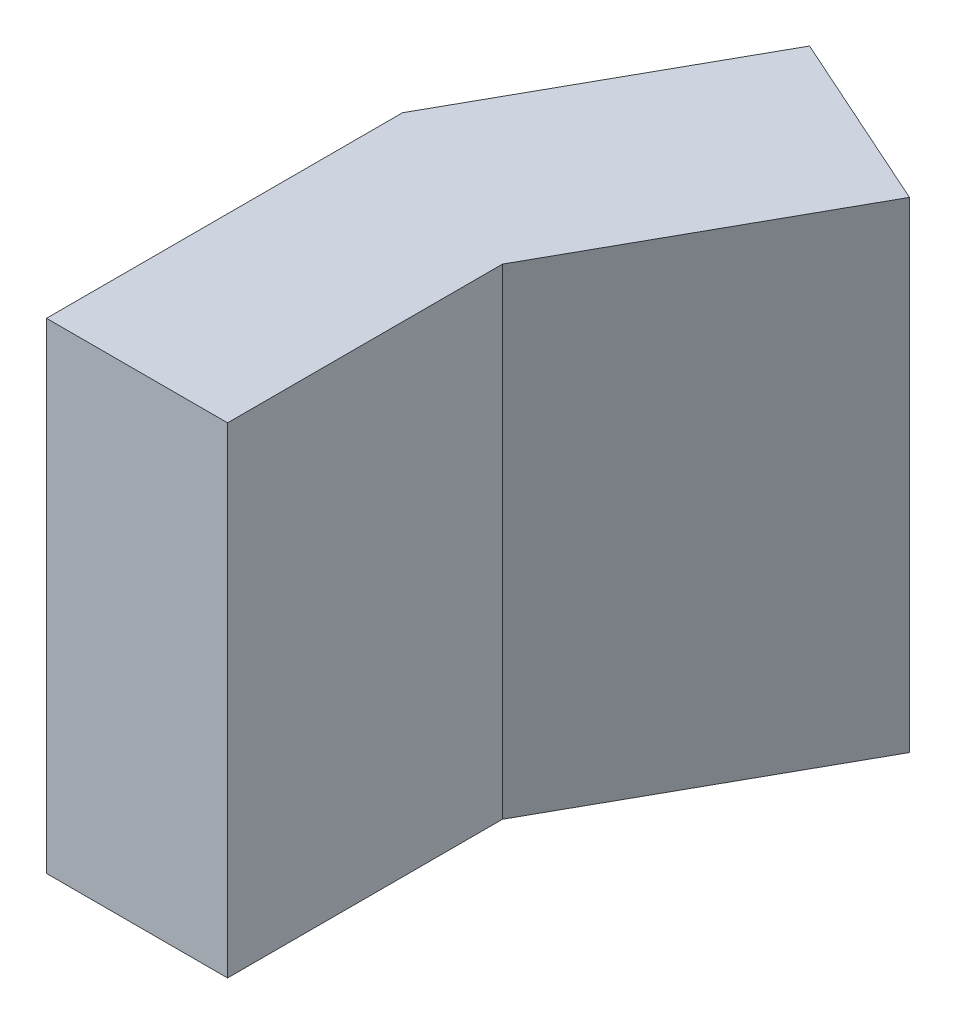
ISO-10303-21;
HEADER;
FILE_DESCRIPTION(('STEP AP214'),'2;1');
FILE_NAME('part.step','',(''),(''),'','','');
FILE_SCHEMA(('AUTOMOTIVE_DESIGN { 1 0 10303 214 1 1 1 1 }'));
ENDSEC;
DATA;
#1=APPLICATION_CONTEXT('core data for automotive mechanical design processes');
#2=APPLICATION_PROTOCOL_DEFINITION('international standard','automotive_design',2000,#1);
#3=PRODUCT_CONTEXT('',#1,'mechanical');
#4=PRODUCT('Part','Part','',(#3));
#5=PRODUCT_RELATED_PRODUCT_CATEGORY('part','',(#4));
#6=PRODUCT_DEFINITION_FORMATION('','',#4);
#7=PRODUCT_DEFINITION_CONTEXT('part definition',#1,'design');
#8=PRODUCT_DEFINITION('design','',#6,#7);
#9=PRODUCT_DEFINITION_SHAPE('','',#8);
#10=(LENGTH_UNIT() NAMED_UNIT(*) SI_UNIT(.MILLI.,.METRE.));
#11=(NAMED_UNIT(*) PLANE_ANGLE_UNIT() SI_UNIT($,.RADIAN.));
#12=(NAMED_UNIT(*) SI_UNIT($,.STERADIAN.) SOLID_ANGLE_UNIT());
#13=UNCERTAINTY_MEASURE_WITH_UNIT(LENGTH_MEASURE(1.E-05),#10,'distance_accuracy_value','');
#14=(GEOMETRIC_REPRESENTATION_CONTEXT(3) GLOBAL_UNCERTAINTY_ASSIGNED_CONTEXT((#13)) GLOBAL_UNIT_ASSIGNED_CONTEXT((#10,
#11,#12)) REPRESENTATION_CONTEXT('',''));
#15=CARTESIAN_POINT('',(0.,0.,0.));
#16=DIRECTION('',(0.,0.,1.));
#17=DIRECTION('',(1.,0.,0.));
#18=AXIS2_PLACEMENT_3D('',#15,#16,#17);
#19=CARTESIAN_POINT('',(-11.,58.42,0.));
#20=DIRECTION('',(-1.,0.,0.));
#21=DIRECTION('',(0.,0.,1.));
#22=AXIS2_PLACEMENT_3D('',#19,#20,#21);
#23=PLANE('',#22);
#24=DIRECTION('',(0.,0.,-1.));
#25=VECTOR('',#24,1.);
#26=CARTESIAN_POINT('',(-11.,0.,0.));
#27=LINE('',#26,#25);
#28=CARTESIAN_POINT('',(-11.,0.,11.0170643207002));
#29=VERTEX_POINT('',#28);
#30=CARTESIAN_POINT('',(-11.,0.,-32.2459666858922));
#31=VERTEX_POINT('',#30);
#32=EDGE_CURVE('E128',#29,#31,#27,.T.);
#33=ORIENTED_EDGE('',*,*,#32,.F.);
#34=DIRECTION('',(0.,-1.,0.));
#35=VECTOR('',#34,1.);
#36=CARTESIAN_POINT('',(-11.,58.42,11.0170643207002));
#37=LINE('',#36,#35);
#38=CARTESIAN_POINT('',(-11.,58.42,11.0170643207002));
#39=VERTEX_POINT('',#38);
#40=EDGE_CURVE('E11',#39,#29,#37,.T.);
#41=ORIENTED_EDGE('',*,*,#40,.F.);
#42=DIRECTION('',(0.,0.,-1.));
#43=VECTOR('',#42,1.);
#44=CARTESIAN_POINT('',(-11.,58.42,0.));
#45=LINE('',#44,#43);
#46=CARTESIAN_POINT('',(-11.,58.42,-32.2459666858922));
#47=VERTEX_POINT('',#46);
#48=EDGE_CURVE('E147',#39,#47,#45,.T.);
#49=ORIENTED_EDGE('',*,*,#48,.T.);
#50=DIRECTION('',(0.,-1.,0.));
#51=VECTOR('',#50,1.);
#52=CARTESIAN_POINT('',(-11.,58.42,-32.2459666858922));
#53=LINE('',#52,#51);
#54=EDGE_CURVE('E58',#47,#31,#53,.T.);
#55=ORIENTED_EDGE('',*,*,#54,.T.);
#56=EDGE_LOOP('',(#33,#41,#49,#55));
#57=FACE_BOUND('',#56,.T.);
#58=ADVANCED_FACE('F41',(#57),#23,.T.);
#59=CARTESIAN_POINT('',(0.,58.42,11.0170643207002));
#60=DIRECTION('',(0.,0.,1.));
#61=DIRECTION('',(1.,0.,0.));
#62=AXIS2_PLACEMENT_3D('',#59,#60,#61);
#63=PLANE('',#62);
#64=DIRECTION('',(-1.,0.,0.));
#65=VECTOR('',#64,1.);
#66=CARTESIAN_POINT('',(0.,0.,11.0170643207002));
#67=LINE('',#66,#65);
#68=CARTESIAN_POINT('',(11.,0.,11.0170643207002));
#69=VERTEX_POINT('',#68);
#70=EDGE_CURVE('E131',#69,#29,#67,.T.);
#71=ORIENTED_EDGE('',*,*,#70,.F.);
#72=DIRECTION('',(0.,-1.,0.));
#73=VECTOR('',#72,1.);
#74=CARTESIAN_POINT('',(11.,58.42,11.0170643207002));
#75=LINE('',#74,#73);
#76=CARTESIAN_POINT('',(11.,58.42,11.0170643207002));
#77=VERTEX_POINT('',#76);
#78=EDGE_CURVE('E50',#77,#69,#75,.T.);
#79=ORIENTED_EDGE('',*,*,#78,.F.);
#80=DIRECTION('',(-1.,0.,0.));
#81=VECTOR('',#80,1.);
#82=CARTESIAN_POINT('',(0.,58.42,11.0170643207002));
#83=LINE('',#82,#81);
#84=EDGE_CURVE('E163',#77,#39,#83,.T.);
#85=ORIENTED_EDGE('',*,*,#84,.T.);
#86=ORIENTED_EDGE('',*,*,#40,.T.);
#87=EDGE_LOOP('',(#71,#79,#85,#86));
#88=FACE_BOUND('',#87,.T.);
#89=ADVANCED_FACE('F162',(#88),#63,.T.);
#90=CARTESIAN_POINT('',(11.,58.42,0.));
#91=DIRECTION('',(-1.,0.,0.));
#92=DIRECTION('',(0.,0.,1.));
#93=AXIS2_PLACEMENT_3D('',#90,#91,#92);
#94=PLANE('',#93);
#95=DIRECTION('',(0.,0.,-1.));
#96=VECTOR('',#95,1.);
#97=CARTESIAN_POINT('',(11.,0.,0.));
#98=LINE('',#97,#96);
#99=CARTESIAN_POINT('',(11.,0.,-22.3872673208331));
#100=VERTEX_POINT('',#99);
#101=EDGE_CURVE('E135',#69,#100,#98,.T.);
#102=ORIENTED_EDGE('',*,*,#101,.T.);
#103=DIRECTION('',(0.,-1.,0.));
#104=VECTOR('',#103,1.);
#105=CARTESIAN_POINT('',(11.,58.42,-22.3872673208331));
#106=LINE('',#105,#104);
#107=CARTESIAN_POINT('',(11.,58.42,-22.3872673208331));
#108=VERTEX_POINT('',#107);
#109=EDGE_CURVE('E118',#108,#100,#106,.T.);
#110=ORIENTED_EDGE('',*,*,#109,.F.);
#111=DIRECTION('',(0.,0.,-1.));
#112=VECTOR('',#111,1.);
#113=CARTESIAN_POINT('',(11.,58.42,0.));
#114=LINE('',#113,#112);
#115=EDGE_CURVE('E104',#77,#108,#114,.T.);
#116=ORIENTED_EDGE('',*,*,#115,.F.);
#117=ORIENTED_EDGE('',*,*,#78,.T.);
#118=EDGE_LOOP('',(#102,#110,#116,#117));
#119=FACE_BOUND('',#118,.T.);
#120=ADVANCED_FACE('F156',(#119),#94,.F.);
#121=CARTESIAN_POINT('',(-1.13277434651285,58.42,-0.631733310959954));
#122=DIRECTION('',(-0.873365917080469,0.,-0.487064651645129));
#123=DIRECTION('',(-0.487064651645129,0.,0.87336591708047));
#124=AXIS2_PLACEMENT_3D('',#121,#122,#123);
#125=PLANE('',#124);
#126=DIRECTION('',(0.487064651645129,0.,-0.87336591708047));
#127=VECTOR('',#126,1.);
#128=CARTESIAN_POINT('',(-1.13277434651285,0.,-0.631733310959954));
#129=LINE('',#128,#127);
#130=CARTESIAN_POINT('',(28.7065561951715,0.,-54.1372673208331));
#131=VERTEX_POINT('',#130);
#132=EDGE_CURVE('E114',#100,#131,#129,.T.);
#133=ORIENTED_EDGE('',*,*,#132,.T.);
#134=DIRECTION('',(0.,-1.,0.));
#135=VECTOR('',#134,1.);
#136=CARTESIAN_POINT('',(28.7065561951715,58.42,-54.1372673208331));
#137=LINE('',#136,#135);
#138=CARTESIAN_POINT('',(28.7065561951715,58.42,-54.1372673208331));
#139=VERTEX_POINT('',#138);
#140=EDGE_CURVE('E111',#139,#131,#137,.T.);
#141=ORIENTED_EDGE('',*,*,#140,.F.);
#142=DIRECTION('',(0.487064651645129,0.,-0.87336591708047));
#143=VECTOR('',#142,1.);
#144=CARTESIAN_POINT('',(-1.13277434651285,58.42,-0.631733310959954));
#145=LINE('',#144,#143);
#146=EDGE_CURVE('E96',#108,#139,#145,.T.);
#147=ORIENTED_EDGE('',*,*,#146,.F.);
#148=ORIENTED_EDGE('',*,*,#109,.T.);
#149=EDGE_LOOP('',(#133,#141,#147,#148));
#150=FACE_BOUND('',#149,.T.);
#151=ADVANCED_FACE('F112',(#150),#125,.F.);
#152=CARTESIAN_POINT('',(25.0037195748658,58.42,-55.7965924589024));
#153=DIRECTION('',(0.408939516978183,0.,-0.912561489135746));
#154=DIRECTION('',(-0.912561489135746,0.,-0.408939516978183));
#155=AXIS2_PLACEMENT_3D('',#152,#153,#154);
#156=PLANE('',#155);
#157=DIRECTION('',(0.912561489135746,0.,0.408939516978183));
#158=VECTOR('',#157,1.);
#159=CARTESIAN_POINT('',(25.0037195748658,0.,-55.7965924589024));
#160=LINE('',#159,#158);
#161=CARTESIAN_POINT('',(6.70655619517152,0.,-63.9959666858922));
#162=VERTEX_POINT('',#161);
#163=EDGE_CURVE('E140',#162,#131,#160,.T.);
#164=ORIENTED_EDGE('',*,*,#163,.F.);
#165=DIRECTION('',(0.,-1.,0.));
#166=VECTOR('',#165,1.);
#167=CARTESIAN_POINT('',(6.70655619517152,58.42,-63.9959666858922));
#168=LINE('',#167,#166);
#169=CARTESIAN_POINT('',(6.70655619517152,58.42,-63.9959666858922));
#170=VERTEX_POINT('',#169);
#171=EDGE_CURVE('E77',#170,#162,#168,.T.);
#172=ORIENTED_EDGE('',*,*,#171,.F.);
#173=DIRECTION('',(0.912561489135746,0.,0.408939516978183));
#174=VECTOR('',#173,1.);
#175=CARTESIAN_POINT('',(25.0037195748658,58.42,-55.7965924589024));
#176=LINE('',#175,#174);
#177=EDGE_CURVE('E101',#170,#139,#176,.T.);
#178=ORIENTED_EDGE('',*,*,#177,.T.);
#179=ORIENTED_EDGE('',*,*,#140,.T.);
#180=EDGE_LOOP('',(#164,#172,#178,#179));
#181=FACE_BOUND('',#180,.T.);
#182=ADVANCED_FACE('F120',(#181),#156,.T.);
#183=CARTESIAN_POINT('',(-22.1074202959966,58.42,-12.3290166866563));
#184=DIRECTION('',(-0.87336591708047,0.,-0.487064651645129));
#185=DIRECTION('',(-0.487064651645129,0.,0.87336591708047));
#186=AXIS2_PLACEMENT_3D('',#183,#184,#185);
#187=PLANE('',#186);
#188=DIRECTION('',(0.487064651645129,0.,-0.873365917080469));
#189=VECTOR('',#188,1.);
#190=CARTESIAN_POINT('',(-22.1074202959966,0.,-12.3290166866563));
#191=LINE('',#190,#189);
#192=EDGE_CURVE('E143',#31,#162,#191,.T.);
#193=ORIENTED_EDGE('',*,*,#192,.F.);
#194=ORIENTED_EDGE('',*,*,#54,.F.);
#195=DIRECTION('',(0.487064651645129,0.,-0.873365917080469));
#196=VECTOR('',#195,1.);
#197=CARTESIAN_POINT('',(-22.1074202959966,58.42,-12.3290166866563));
#198=LINE('',#197,#196);
#199=EDGE_CURVE('E122',#47,#170,#198,.T.);
#200=ORIENTED_EDGE('',*,*,#199,.T.);
#201=ORIENTED_EDGE('',*,*,#171,.T.);
#202=EDGE_LOOP('',(#193,#194,#200,#201));
#203=FACE_BOUND('',#202,.T.);
#204=ADVANCED_FACE('F164',(#203),#187,.T.);
#205=CARTESIAN_POINT('',(0.,58.42,0.));
#206=DIRECTION('',(0.,1.,0.));
#207=DIRECTION('',(0.,0.,1.));
#208=AXIS2_PLACEMENT_3D('',#205,#206,#207);
#209=PLANE('',#208);
#210=ORIENTED_EDGE('',*,*,#48,.F.);
#211=ORIENTED_EDGE('',*,*,#84,.F.);
#212=ORIENTED_EDGE('',*,*,#115,.T.);
#213=ORIENTED_EDGE('',*,*,#146,.T.);
#214=ORIENTED_EDGE('',*,*,#177,.F.);
#215=ORIENTED_EDGE('',*,*,#199,.F.);
#216=EDGE_LOOP('',(#210,#211,#212,#213,#214,#215));
#217=FACE_BOUND('',#216,.T.);
#218=ADVANCED_FACE('F98',(#217),#209,.T.);
#219=CARTESIAN_POINT('',(0.,0.,0.));
#220=DIRECTION('',(0.,1.,0.));
#221=DIRECTION('',(0.,0.,1.));
#222=AXIS2_PLACEMENT_3D('',#219,#220,#221);
#223=PLANE('',#222);
#224=ORIENTED_EDGE('',*,*,#32,.T.);
#225=ORIENTED_EDGE('',*,*,#192,.T.);
#226=ORIENTED_EDGE('',*,*,#163,.T.);
#227=ORIENTED_EDGE('',*,*,#132,.F.);
#228=ORIENTED_EDGE('',*,*,#101,.F.);
#229=ORIENTED_EDGE('',*,*,#70,.T.);
#230=EDGE_LOOP('',(#224,#225,#226,#227,#228,#229));
#231=FACE_BOUND('',#230,.T.);
#232=ADVANCED_FACE('F161',(#231),#223,.F.);
#233=CLOSED_SHELL('',(#58,#89,#120,#151,#182,#204,#218,#232));
#234=MANIFOLD_SOLID_BREP('B2',#233);
#235=ADVANCED_BREP_SHAPE_REPRESENTATION('',(#18,#234),#14);
#236=SHAPE_DEFINITION_REPRESENTATION(#9,#235);
ENDSEC;
END-ISO-10303-21;
